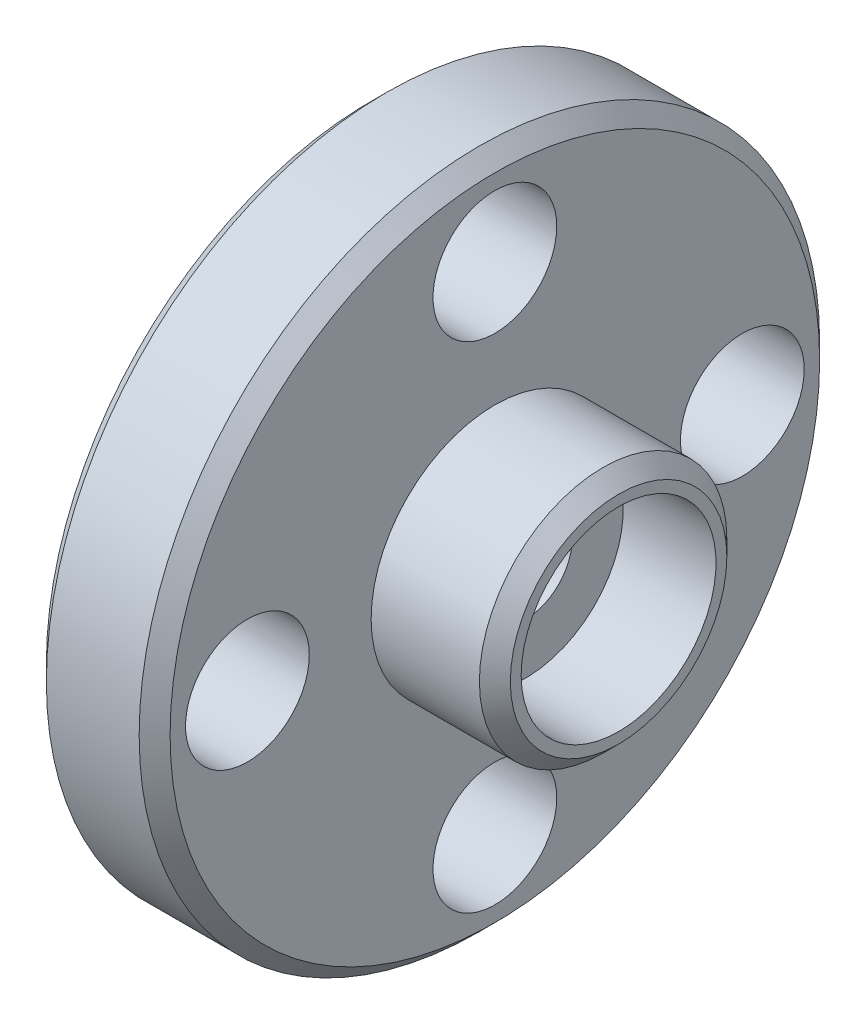
ISO-10303-21;
HEADER;
FILE_DESCRIPTION(('STEP AP214'),'2;1');
FILE_NAME('part.step','',(''),(''),'','','');
FILE_SCHEMA(('AUTOMOTIVE_DESIGN { 1 0 10303 214 1 1 1 1 }'));
ENDSEC;
DATA;
#1=APPLICATION_CONTEXT('core data for automotive mechanical design processes');
#2=APPLICATION_PROTOCOL_DEFINITION('international standard','automotive_design',2000,#1);
#3=PRODUCT_CONTEXT('',#1,'mechanical');
#4=PRODUCT('Part','Part','',(#3));
#5=PRODUCT_RELATED_PRODUCT_CATEGORY('part','',(#4));
#6=PRODUCT_DEFINITION_FORMATION('','',#4);
#7=PRODUCT_DEFINITION_CONTEXT('part definition',#1,'design');
#8=PRODUCT_DEFINITION('design','',#6,#7);
#9=PRODUCT_DEFINITION_SHAPE('','',#8);
#10=(LENGTH_UNIT() NAMED_UNIT(*) SI_UNIT(.MILLI.,.METRE.));
#11=(NAMED_UNIT(*) PLANE_ANGLE_UNIT() SI_UNIT($,.RADIAN.));
#12=(NAMED_UNIT(*) SI_UNIT($,.STERADIAN.) SOLID_ANGLE_UNIT());
#13=UNCERTAINTY_MEASURE_WITH_UNIT(LENGTH_MEASURE(1.E-05),#10,'distance_accuracy_value','');
#14=(GEOMETRIC_REPRESENTATION_CONTEXT(3) GLOBAL_UNCERTAINTY_ASSIGNED_CONTEXT((#13)) GLOBAL_UNIT_ASSIGNED_CONTEXT((#10,
#11,#12)) REPRESENTATION_CONTEXT('',''));
#15=CARTESIAN_POINT('',(0.,0.,0.));
#16=DIRECTION('',(0.,0.,1.));
#17=DIRECTION('',(1.,0.,0.));
#18=AXIS2_PLACEMENT_3D('',#15,#16,#17);
#19=CARTESIAN_POINT('',(8.,0.,0.));
#20=DIRECTION('',(-1.,0.,0.));
#21=DIRECTION('',(0.,0.,1.));
#22=AXIS2_PLACEMENT_3D('',#19,#20,#21);
#23=CYLINDRICAL_SURFACE('',#22,3.15);
#24=CARTESIAN_POINT('',(5.,0.,0.));
#25=DIRECTION('',(-1.,0.,0.));
#26=DIRECTION('',(0.,0.,1.));
#27=AXIS2_PLACEMENT_3D('',#24,#25,#26);
#28=CIRCLE('',#27,3.15);
#29=CARTESIAN_POINT('',(5.,0.,3.15));
#30=VERTEX_POINT('',#29);
#31=EDGE_CURVE('E93',#30,#30,#28,.F.);
#32=ORIENTED_EDGE('',*,*,#31,.F.);
#33=EDGE_LOOP('',(#32));
#34=FACE_BOUND('',#33,.T.);
#35=CARTESIAN_POINT('',(8.,0.,0.));
#36=DIRECTION('',(-1.,0.,0.));
#37=DIRECTION('',(0.,0.,1.));
#38=AXIS2_PLACEMENT_3D('',#35,#36,#37);
#39=CIRCLE('',#38,3.15);
#40=CARTESIAN_POINT('',(8.,0.,3.15));
#41=VERTEX_POINT('',#40);
#42=EDGE_CURVE('E18',#41,#41,#39,.T.);
#43=ORIENTED_EDGE('',*,*,#42,.F.);
#44=EDGE_LOOP('',(#43));
#45=FACE_BOUND('',#44,.T.);
#46=ADVANCED_FACE('F15',(#34,#45),#23,.F.);
#47=CARTESIAN_POINT('',(8.,0.,0.));
#48=DIRECTION('',(1.,0.,0.));
#49=DIRECTION('',(0.,0.,-1.));
#50=AXIS2_PLACEMENT_3D('',#47,#48,#49);
#51=PLANE('',#50);
#52=CARTESIAN_POINT('',(7.99999999998136,0.,0.));
#53=DIRECTION('',(-1.,0.,0.));
#54=DIRECTION('',(0.,-1.,0.));
#55=AXIS2_PLACEMENT_3D('',#52,#53,#54);
#56=CIRCLE('',#55,3.49999999997408);
#57=CARTESIAN_POINT('',(7.99999999998136,-3.49999999997408,0.));
#58=VERTEX_POINT('',#57);
#59=EDGE_CURVE('E90',#58,#58,#56,.T.);
#60=ORIENTED_EDGE('',*,*,#59,.F.);
#61=EDGE_LOOP('',(#60));
#62=FACE_BOUND('',#61,.T.);
#63=ORIENTED_EDGE('',*,*,#42,.T.);
#64=EDGE_LOOP('',(#63));
#65=FACE_BOUND('',#64,.T.);
#66=ADVANCED_FACE('F102',(#62,#65),#51,.T.);
#67=CARTESIAN_POINT('',(5.,0.,0.));
#68=DIRECTION('',(1.,0.,0.));
#69=DIRECTION('',(0.,0.,-1.));
#70=AXIS2_PLACEMENT_3D('',#67,#68,#69);
#71=PLANE('',#70);
#72=ORIENTED_EDGE('',*,*,#31,.T.);
#73=EDGE_LOOP('',(#72));
#74=FACE_BOUND('',#73,.T.);
#75=CARTESIAN_POINT('',(5.,0.,0.));
#76=DIRECTION('',(1.,0.,0.));
#77=DIRECTION('',(0.,0.,-1.));
#78=AXIS2_PLACEMENT_3D('',#75,#76,#77);
#79=CIRCLE('',#78,1.5);
#80=CARTESIAN_POINT('',(5.,0.,-1.5));
#81=VERTEX_POINT('',#80);
#82=EDGE_CURVE('E86',#81,#81,#79,.F.);
#83=ORIENTED_EDGE('',*,*,#82,.T.);
#84=EDGE_LOOP('',(#83));
#85=FACE_BOUND('',#84,.T.);
#86=ADVANCED_FACE('F110',(#74,#85),#71,.T.);
#87=CARTESIAN_POINT('',(7.50000000005002,0.,0.));
#88=DIRECTION('',(-1.,0.,0.));
#89=DIRECTION('',(0.,-1.,0.));
#90=AXIS2_PLACEMENT_3D('',#87,#88,#89);
#91=CONICAL_SURFACE('',#90,3.99999999990541,0.785398163397448);
#92=ORIENTED_EDGE('',*,*,#59,.T.);
#93=EDGE_LOOP('',(#92));
#94=FACE_BOUND('',#93,.T.);
#95=CARTESIAN_POINT('',(7.5,0.,0.));
#96=DIRECTION('',(1.,0.,0.));
#97=DIRECTION('',(0.,0.,-1.));
#98=AXIS2_PLACEMENT_3D('',#95,#96,#97);
#99=CIRCLE('',#98,4.);
#100=CARTESIAN_POINT('',(7.5,0.,-4.));
#101=VERTEX_POINT('',#100);
#102=EDGE_CURVE('E33',#101,#101,#99,.F.);
#103=ORIENTED_EDGE('',*,*,#102,.F.);
#104=EDGE_LOOP('',(#103));
#105=FACE_BOUND('',#104,.T.);
#106=ADVANCED_FACE('F171',(#94,#105),#91,.T.);
#107=CARTESIAN_POINT('',(4.,0.,0.));
#108=DIRECTION('',(1.,0.,0.));
#109=DIRECTION('',(0.,0.,-1.));
#110=AXIS2_PLACEMENT_3D('',#107,#108,#109);
#111=CYLINDRICAL_SURFACE('',#110,1.5);
#112=CARTESIAN_POINT('',(2.5,0.,0.));
#113=DIRECTION('',(1.,0.,0.));
#114=DIRECTION('',(0.,0.,-1.));
#115=AXIS2_PLACEMENT_3D('',#112,#113,#114);
#116=CIRCLE('',#115,1.5);
#117=CARTESIAN_POINT('',(2.5,0.,-1.5));
#118=VERTEX_POINT('',#117);
#119=EDGE_CURVE('E82',#118,#118,#116,.F.);
#120=ORIENTED_EDGE('',*,*,#119,.T.);
#121=EDGE_LOOP('',(#120));
#122=FACE_BOUND('',#121,.T.);
#123=ORIENTED_EDGE('',*,*,#82,.F.);
#124=EDGE_LOOP('',(#123));
#125=FACE_BOUND('',#124,.T.);
#126=ADVANCED_FACE('F167',(#122,#125),#111,.F.);
#127=CARTESIAN_POINT('',(3.5,0.,0.));
#128=DIRECTION('',(-1.,0.,0.));
#129=DIRECTION('',(0.,0.,1.));
#130=AXIS2_PLACEMENT_3D('',#127,#128,#129);
#131=CONICAL_SURFACE('',#130,11.,0.785398163397449);
#132=CARTESIAN_POINT('',(4.,0.,0.));
#133=DIRECTION('',(-1.,0.,0.));
#134=DIRECTION('',(0.,0.,1.));
#135=AXIS2_PLACEMENT_3D('',#132,#133,#134);
#136=CIRCLE('',#135,10.5);
#137=CARTESIAN_POINT('',(4.,0.,10.5));
#138=VERTEX_POINT('',#137);
#139=EDGE_CURVE('E77',#138,#138,#136,.F.);
#140=ORIENTED_EDGE('',*,*,#139,.F.);
#141=EDGE_LOOP('',(#140));
#142=FACE_BOUND('',#141,.T.);
#143=CARTESIAN_POINT('',(3.5,0.,0.));
#144=DIRECTION('',(1.,0.,0.));
#145=DIRECTION('',(0.,0.,-1.));
#146=AXIS2_PLACEMENT_3D('',#143,#144,#145);
#147=CIRCLE('',#146,11.);
#148=CARTESIAN_POINT('',(3.5,0.,-11.));
#149=VERTEX_POINT('',#148);
#150=EDGE_CURVE('E81',#149,#149,#147,.F.);
#151=ORIENTED_EDGE('',*,*,#150,.F.);
#152=EDGE_LOOP('',(#151));
#153=FACE_BOUND('',#152,.T.);
#154=ADVANCED_FACE('F163',(#142,#153),#131,.T.);
#155=CARTESIAN_POINT('',(4.,0.,0.));
#156=DIRECTION('',(1.,0.,0.));
#157=DIRECTION('',(0.,0.,-1.));
#158=AXIS2_PLACEMENT_3D('',#155,#156,#157);
#159=CYLINDRICAL_SURFACE('',#158,4.);
#160=ORIENTED_EDGE('',*,*,#102,.T.);
#161=EDGE_LOOP('',(#160));
#162=FACE_BOUND('',#161,.T.);
#163=CARTESIAN_POINT('',(4.,0.,0.));
#164=DIRECTION('',(1.,0.,0.));
#165=DIRECTION('',(0.,0.,-1.));
#166=AXIS2_PLACEMENT_3D('',#163,#164,#165);
#167=CIRCLE('',#166,4.);
#168=CARTESIAN_POINT('',(4.,0.,-4.));
#169=VERTEX_POINT('',#168);
#170=EDGE_CURVE('E73',#169,#169,#167,.F.);
#171=ORIENTED_EDGE('',*,*,#170,.F.);
#172=EDGE_LOOP('',(#171));
#173=FACE_BOUND('',#172,.T.);
#174=ADVANCED_FACE('F159',(#162,#173),#159,.T.);
#175=CARTESIAN_POINT('',(2.5,0.,0.));
#176=DIRECTION('',(1.,0.,0.));
#177=DIRECTION('',(0.,0.,-1.));
#178=AXIS2_PLACEMENT_3D('',#175,#176,#177);
#179=PLANE('',#178);
#180=CARTESIAN_POINT('',(2.5,0.,0.));
#181=DIRECTION('',(1.,0.,0.));
#182=DIRECTION('',(0.,0.,-1.));
#183=AXIS2_PLACEMENT_3D('',#180,#181,#182);
#184=CIRCLE('',#183,3.15);
#185=CARTESIAN_POINT('',(2.5,0.,-3.15));
#186=VERTEX_POINT('',#185);
#187=EDGE_CURVE('E69',#186,#186,#184,.F.);
#188=ORIENTED_EDGE('',*,*,#187,.T.);
#189=EDGE_LOOP('',(#188));
#190=FACE_BOUND('',#189,.T.);
#191=ORIENTED_EDGE('',*,*,#119,.F.);
#192=EDGE_LOOP('',(#191));
#193=FACE_BOUND('',#192,.T.);
#194=ADVANCED_FACE('F155',(#190,#193),#179,.F.);
#195=CARTESIAN_POINT('',(0.,0.,0.));
#196=DIRECTION('',(1.,0.,0.));
#197=DIRECTION('',(0.,0.,-1.));
#198=AXIS2_PLACEMENT_3D('',#195,#196,#197);
#199=CYLINDRICAL_SURFACE('',#198,11.);
#200=ORIENTED_EDGE('',*,*,#150,.T.);
#201=EDGE_LOOP('',(#200));
#202=FACE_BOUND('',#201,.T.);
#203=CARTESIAN_POINT('',(0.5,0.,0.));
#204=DIRECTION('',(1.,0.,0.));
#205=DIRECTION('',(0.,-1.,0.));
#206=AXIS2_PLACEMENT_3D('',#203,#204,#205);
#207=CIRCLE('',#206,11.);
#208=CARTESIAN_POINT('',(0.5,-11.,0.));
#209=VERTEX_POINT('',#208);
#210=EDGE_CURVE('E68',#209,#209,#207,.F.);
#211=ORIENTED_EDGE('',*,*,#210,.F.);
#212=EDGE_LOOP('',(#211));
#213=FACE_BOUND('',#212,.T.);
#214=ADVANCED_FACE('F151',(#202,#213),#199,.T.);
#215=CARTESIAN_POINT('',(4.,0.,0.));
#216=DIRECTION('',(1.,0.,0.));
#217=DIRECTION('',(0.,0.,-1.));
#218=AXIS2_PLACEMENT_3D('',#215,#216,#217);
#219=PLANE('',#218);
#220=ORIENTED_EDGE('',*,*,#170,.T.);
#221=EDGE_LOOP('',(#220));
#222=FACE_BOUND('',#221,.T.);
#223=CARTESIAN_POINT('',(4.,8.,0.));
#224=DIRECTION('',(1.,0.,0.));
#225=DIRECTION('',(0.,0.,-1.));
#226=AXIS2_PLACEMENT_3D('',#223,#224,#225);
#227=CIRCLE('',#226,2.);
#228=CARTESIAN_POINT('',(4.,8.,-2.));
#229=VERTEX_POINT('',#228);
#230=EDGE_CURVE('E52',#229,#229,#227,.F.);
#231=ORIENTED_EDGE('',*,*,#230,.T.);
#232=EDGE_LOOP('',(#231));
#233=FACE_BOUND('',#232,.T.);
#234=CARTESIAN_POINT('',(4.,-8.,0.));
#235=DIRECTION('',(1.,0.,0.));
#236=DIRECTION('',(0.,0.,-1.));
#237=AXIS2_PLACEMENT_3D('',#234,#235,#236);
#238=CIRCLE('',#237,2.);
#239=CARTESIAN_POINT('',(4.,-8.,-2.));
#240=VERTEX_POINT('',#239);
#241=EDGE_CURVE('E56',#240,#240,#238,.F.);
#242=ORIENTED_EDGE('',*,*,#241,.T.);
#243=EDGE_LOOP('',(#242));
#244=FACE_BOUND('',#243,.T.);
#245=CARTESIAN_POINT('',(4.,0.,8.));
#246=DIRECTION('',(1.,0.,0.));
#247=DIRECTION('',(0.,0.,-1.));
#248=AXIS2_PLACEMENT_3D('',#245,#246,#247);
#249=CIRCLE('',#248,2.);
#250=CARTESIAN_POINT('',(4.,0.,6.));
#251=VERTEX_POINT('',#250);
#252=EDGE_CURVE('E60',#251,#251,#249,.F.);
#253=ORIENTED_EDGE('',*,*,#252,.T.);
#254=EDGE_LOOP('',(#253));
#255=FACE_BOUND('',#254,.T.);
#256=CARTESIAN_POINT('',(4.,0.,-8.));
#257=DIRECTION('',(1.,0.,0.));
#258=DIRECTION('',(0.,0.,-1.));
#259=AXIS2_PLACEMENT_3D('',#256,#257,#258);
#260=CIRCLE('',#259,2.);
#261=CARTESIAN_POINT('',(4.,0.,-10.));
#262=VERTEX_POINT('',#261);
#263=EDGE_CURVE('E64',#262,#262,#260,.F.);
#264=ORIENTED_EDGE('',*,*,#263,.T.);
#265=EDGE_LOOP('',(#264));
#266=FACE_BOUND('',#265,.T.);
#267=ORIENTED_EDGE('',*,*,#139,.T.);
#268=EDGE_LOOP('',(#267));
#269=FACE_BOUND('',#268,.T.);
#270=ADVANCED_FACE('F147',(#222,#233,#244,#255,#266,#269),#219,.T.);
#271=CARTESIAN_POINT('',(0.,0.,0.));
#272=DIRECTION('',(1.,0.,0.));
#273=DIRECTION('',(0.,0.,-1.));
#274=AXIS2_PLACEMENT_3D('',#271,#272,#273);
#275=CYLINDRICAL_SURFACE('',#274,3.15);
#276=ORIENTED_EDGE('',*,*,#187,.F.);
#277=EDGE_LOOP('',(#276));
#278=FACE_BOUND('',#277,.T.);
#279=CARTESIAN_POINT('',(0.499999999988177,0.,0.));
#280=DIRECTION('',(-1.,0.,0.));
#281=DIRECTION('',(0.,0.,-1.));
#282=AXIS2_PLACEMENT_3D('',#279,#280,#281);
#283=CIRCLE('',#282,3.15000000000509);
#284=CARTESIAN_POINT('',(0.499999999988177,0.,-3.15000000000509));
#285=VERTEX_POINT('',#284);
#286=EDGE_CURVE('E51',#285,#285,#283,.F.);
#287=ORIENTED_EDGE('',*,*,#286,.F.);
#288=EDGE_LOOP('',(#287));
#289=FACE_BOUND('',#288,.T.);
#290=ADVANCED_FACE('F143',(#278,#289),#275,.F.);
#291=CARTESIAN_POINT('',(0.5,0.,0.));
#292=DIRECTION('',(1.,0.,0.));
#293=DIRECTION('',(0.,0.,-1.));
#294=AXIS2_PLACEMENT_3D('',#291,#292,#293);
#295=CONICAL_SURFACE('',#294,11.,0.785398163397449);
#296=ORIENTED_EDGE('',*,*,#210,.T.);
#297=EDGE_LOOP('',(#296));
#298=FACE_BOUND('',#297,.T.);
#299=CARTESIAN_POINT('',(0.,0.,0.));
#300=DIRECTION('',(1.,0.,0.));
#301=DIRECTION('',(0.,0.,-1.));
#302=AXIS2_PLACEMENT_3D('',#299,#300,#301);
#303=CIRCLE('',#302,10.5);
#304=CARTESIAN_POINT('',(0.,0.,-10.5));
#305=VERTEX_POINT('',#304);
#306=EDGE_CURVE('E47',#305,#305,#303,.T.);
#307=ORIENTED_EDGE('',*,*,#306,.T.);
#308=EDGE_LOOP('',(#307));
#309=FACE_BOUND('',#308,.T.);
#310=ADVANCED_FACE('F139',(#298,#309),#295,.T.);
#311=CARTESIAN_POINT('',(0.,0.,-8.));
#312=DIRECTION('',(1.,0.,0.));
#313=DIRECTION('',(0.,0.,-1.));
#314=AXIS2_PLACEMENT_3D('',#311,#312,#313);
#315=CYLINDRICAL_SURFACE('',#314,2.);
#316=CARTESIAN_POINT('',(0.,0.,-8.));
#317=DIRECTION('',(1.,0.,0.));
#318=DIRECTION('',(0.,0.,-1.));
#319=AXIS2_PLACEMENT_3D('',#316,#317,#318);
#320=CIRCLE('',#319,2.);
#321=CARTESIAN_POINT('',(0.,0.,-10.));
#322=VERTEX_POINT('',#321);
#323=EDGE_CURVE('E43',#322,#322,#320,.F.);
#324=ORIENTED_EDGE('',*,*,#323,.T.);
#325=EDGE_LOOP('',(#324));
#326=FACE_BOUND('',#325,.T.);
#327=ORIENTED_EDGE('',*,*,#263,.F.);
#328=EDGE_LOOP('',(#327));
#329=FACE_BOUND('',#328,.T.);
#330=ADVANCED_FACE('F135',(#326,#329),#315,.F.);
#331=CARTESIAN_POINT('',(0.,0.,8.));
#332=DIRECTION('',(1.,0.,0.));
#333=DIRECTION('',(0.,0.,-1.));
#334=AXIS2_PLACEMENT_3D('',#331,#332,#333);
#335=CYLINDRICAL_SURFACE('',#334,2.);
#336=CARTESIAN_POINT('',(0.,0.,8.));
#337=DIRECTION('',(1.,0.,0.));
#338=DIRECTION('',(0.,0.,-1.));
#339=AXIS2_PLACEMENT_3D('',#336,#337,#338);
#340=CIRCLE('',#339,2.);
#341=CARTESIAN_POINT('',(0.,0.,6.));
#342=VERTEX_POINT('',#341);
#343=EDGE_CURVE('E39',#342,#342,#340,.F.);
#344=ORIENTED_EDGE('',*,*,#343,.T.);
#345=EDGE_LOOP('',(#344));
#346=FACE_BOUND('',#345,.T.);
#347=ORIENTED_EDGE('',*,*,#252,.F.);
#348=EDGE_LOOP('',(#347));
#349=FACE_BOUND('',#348,.T.);
#350=ADVANCED_FACE('F131',(#346,#349),#335,.F.);
#351=CARTESIAN_POINT('',(0.,-8.,0.));
#352=DIRECTION('',(1.,0.,0.));
#353=DIRECTION('',(0.,0.,-1.));
#354=AXIS2_PLACEMENT_3D('',#351,#352,#353);
#355=CYLINDRICAL_SURFACE('',#354,2.);
#356=CARTESIAN_POINT('',(0.,-8.,0.));
#357=DIRECTION('',(1.,0.,0.));
#358=DIRECTION('',(0.,0.,-1.));
#359=AXIS2_PLACEMENT_3D('',#356,#357,#358);
#360=CIRCLE('',#359,2.);
#361=CARTESIAN_POINT('',(0.,-8.,-2.));
#362=VERTEX_POINT('',#361);
#363=EDGE_CURVE('E30',#362,#362,#360,.F.);
#364=ORIENTED_EDGE('',*,*,#363,.T.);
#365=EDGE_LOOP('',(#364));
#366=FACE_BOUND('',#365,.T.);
#367=ORIENTED_EDGE('',*,*,#241,.F.);
#368=EDGE_LOOP('',(#367));
#369=FACE_BOUND('',#368,.T.);
#370=ADVANCED_FACE('F127',(#366,#369),#355,.F.);
#371=CARTESIAN_POINT('',(0.,8.,0.));
#372=DIRECTION('',(1.,0.,0.));
#373=DIRECTION('',(0.,0.,-1.));
#374=AXIS2_PLACEMENT_3D('',#371,#372,#373);
#375=CYLINDRICAL_SURFACE('',#374,2.);
#376=CARTESIAN_POINT('',(0.,8.,0.));
#377=DIRECTION('',(1.,0.,0.));
#378=DIRECTION('',(0.,0.,-1.));
#379=AXIS2_PLACEMENT_3D('',#376,#377,#378);
#380=CIRCLE('',#379,2.);
#381=CARTESIAN_POINT('',(0.,8.,-2.));
#382=VERTEX_POINT('',#381);
#383=EDGE_CURVE('E23',#382,#382,#380,.F.);
#384=ORIENTED_EDGE('',*,*,#383,.T.);
#385=EDGE_LOOP('',(#384));
#386=FACE_BOUND('',#385,.T.);
#387=ORIENTED_EDGE('',*,*,#230,.F.);
#388=EDGE_LOOP('',(#387));
#389=FACE_BOUND('',#388,.T.);
#390=ADVANCED_FACE('F120',(#386,#389),#375,.F.);
#391=CARTESIAN_POINT('',(0.50000000004502,0.,0.));
#392=DIRECTION('',(-1.,0.,0.));
#393=DIRECTION('',(0.,0.,1.));
#394=AXIS2_PLACEMENT_3D('',#391,#392,#393);
#395=CONICAL_SURFACE('',#394,3.14999999994825,0.785398163397448);
#396=ORIENTED_EDGE('',*,*,#286,.T.);
#397=EDGE_LOOP('',(#396));
#398=FACE_BOUND('',#397,.T.);
#399=CARTESIAN_POINT('',(5.6843418860808E-11,0.,0.));
#400=DIRECTION('',(-1.,0.,0.));
#401=DIRECTION('',(0.,0.,1.));
#402=AXIS2_PLACEMENT_3D('',#399,#400,#401);
#403=CIRCLE('',#402,3.64999999993643);
#404=CARTESIAN_POINT('',(5.6843418860808E-11,0.,3.64999999993643));
#405=VERTEX_POINT('',#404);
#406=EDGE_CURVE('E10',#405,#405,#403,.T.);
#407=ORIENTED_EDGE('',*,*,#406,.T.);
#408=EDGE_LOOP('',(#407));
#409=FACE_BOUND('',#408,.T.);
#410=ADVANCED_FACE('F114',(#398,#409),#395,.F.);
#411=CARTESIAN_POINT('',(0.,0.,0.));
#412=DIRECTION('',(1.,0.,0.));
#413=DIRECTION('',(0.,0.,-1.));
#414=AXIS2_PLACEMENT_3D('',#411,#412,#413);
#415=PLANE('',#414);
#416=ORIENTED_EDGE('',*,*,#406,.F.);
#417=EDGE_LOOP('',(#416));
#418=FACE_BOUND('',#417,.T.);
#419=ORIENTED_EDGE('',*,*,#383,.F.);
#420=EDGE_LOOP('',(#419));
#421=FACE_BOUND('',#420,.T.);
#422=ORIENTED_EDGE('',*,*,#363,.F.);
#423=EDGE_LOOP('',(#422));
#424=FACE_BOUND('',#423,.T.);
#425=ORIENTED_EDGE('',*,*,#343,.F.);
#426=EDGE_LOOP('',(#425));
#427=FACE_BOUND('',#426,.T.);
#428=ORIENTED_EDGE('',*,*,#323,.F.);
#429=EDGE_LOOP('',(#428));
#430=FACE_BOUND('',#429,.T.);
#431=ORIENTED_EDGE('',*,*,#306,.F.);
#432=EDGE_LOOP('',(#431));
#433=FACE_BOUND('',#432,.T.);
#434=ADVANCED_FACE('F112',(#418,#421,#424,#427,#430,#433),#415,.F.);
#435=CLOSED_SHELL('',(#46,#66,#86,#106,#126,#154,#174,#194,#214,#270,#290,#310,#330,#350,#370,
#390,#410,#434));
#436=MANIFOLD_SOLID_BREP('B1',#435);
#437=ADVANCED_BREP_SHAPE_REPRESENTATION('',(#18,#436),#14);
#438=SHAPE_DEFINITION_REPRESENTATION(#9,#437);
ENDSEC;
END-ISO-10303-21;
